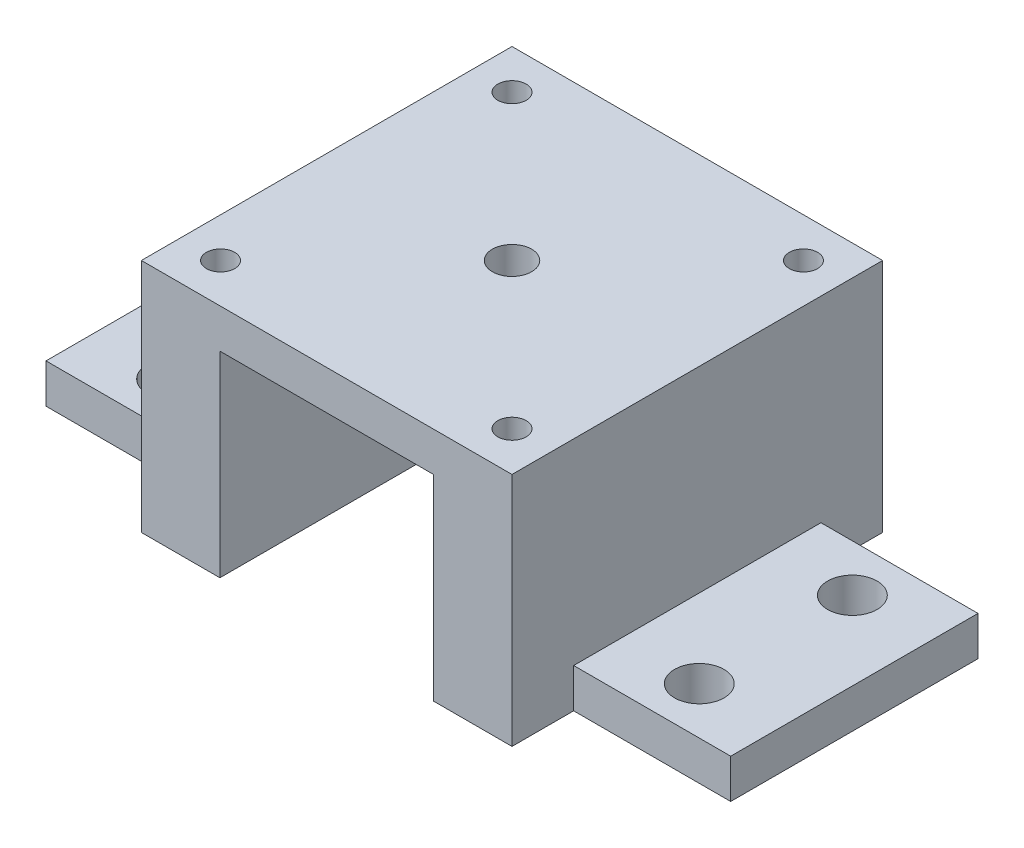
ISO-10303-21;
HEADER;
FILE_DESCRIPTION(('STEP AP214'),'2;1');
FILE_NAME('part.step','',(''),(''),'','','');
FILE_SCHEMA(('AUTOMOTIVE_DESIGN { 1 0 10303 214 1 1 1 1 }'));
ENDSEC;
DATA;
#1=APPLICATION_CONTEXT('core data for automotive mechanical design processes');
#2=APPLICATION_PROTOCOL_DEFINITION('international standard','automotive_design',2000,#1);
#3=PRODUCT_CONTEXT('',#1,'mechanical');
#4=PRODUCT('Part','Part','',(#3));
#5=PRODUCT_RELATED_PRODUCT_CATEGORY('part','',(#4));
#6=PRODUCT_DEFINITION_FORMATION('','',#4);
#7=PRODUCT_DEFINITION_CONTEXT('part definition',#1,'design');
#8=PRODUCT_DEFINITION('design','',#6,#7);
#9=PRODUCT_DEFINITION_SHAPE('','',#8);
#10=(LENGTH_UNIT() NAMED_UNIT(*) SI_UNIT(.MILLI.,.METRE.));
#11=(NAMED_UNIT(*) PLANE_ANGLE_UNIT() SI_UNIT($,.RADIAN.));
#12=(NAMED_UNIT(*) SI_UNIT($,.STERADIAN.) SOLID_ANGLE_UNIT());
#13=UNCERTAINTY_MEASURE_WITH_UNIT(LENGTH_MEASURE(1.E-05),#10,'distance_accuracy_value','');
#14=(GEOMETRIC_REPRESENTATION_CONTEXT(3) GLOBAL_UNCERTAINTY_ASSIGNED_CONTEXT((#13)) GLOBAL_UNIT_ASSIGNED_CONTEXT((#10,
#11,#12)) REPRESENTATION_CONTEXT('',''));
#15=CARTESIAN_POINT('',(0.,0.,0.));
#16=DIRECTION('',(0.,0.,1.));
#17=DIRECTION('',(1.,0.,0.));
#18=AXIS2_PLACEMENT_3D('',#15,#16,#17);
#19=CARTESIAN_POINT('',(-59.944,38.1,-25.0118450704225));
#20=DIRECTION('',(1.,0.,0.));
#21=DIRECTION('',(0.,0.,-1.));
#22=AXIS2_PLACEMENT_3D('',#19,#20,#21);
#23=PLANE('',#22);
#24=DIRECTION('',(0.,-1.,0.));
#25=VECTOR('',#24,1.);
#26=CARTESIAN_POINT('',(-59.944,0.,-15.0398451924225));
#27=LINE('',#26,#25);
#28=CARTESIAN_POINT('',(-59.944,6.35,-15.0398451924225));
#29=VERTEX_POINT('',#28);
#30=CARTESIAN_POINT('',(-59.944,0.,-15.0398451924225));
#31=VERTEX_POINT('',#30);
#32=EDGE_CURVE('E61',#29,#31,#27,.T.);
#33=ORIENTED_EDGE('',*,*,#32,.F.);
#34=DIRECTION('',(0.,0.,-1.));
#35=VECTOR('',#34,1.);
#36=CARTESIAN_POINT('',(-59.944,6.35,-15.0398451924225));
#37=LINE('',#36,#35);
#38=CARTESIAN_POINT('',(-59.944,6.35,24.9601548075775));
#39=VERTEX_POINT('',#38);
#40=EDGE_CURVE('E181',#39,#29,#37,.T.);
#41=ORIENTED_EDGE('',*,*,#40,.F.);
#42=DIRECTION('',(0.,1.,0.));
#43=VECTOR('',#42,1.);
#44=CARTESIAN_POINT('',(-59.944,0.,24.9601548075775));
#45=LINE('',#44,#43);
#46=CARTESIAN_POINT('',(-59.944,0.,24.9601548075775));
#47=VERTEX_POINT('',#46);
#48=EDGE_CURVE('E67',#47,#39,#45,.T.);
#49=ORIENTED_EDGE('',*,*,#48,.F.);
#50=DIRECTION('',(0.,0.,1.));
#51=VECTOR('',#50,1.);
#52=CARTESIAN_POINT('',(-59.944,0.,-25.0118450704225));
#53=LINE('',#52,#51);
#54=CARTESIAN_POINT('',(-59.944,0.,34.9321549295775));
#55=VERTEX_POINT('',#54);
#56=EDGE_CURVE('E263',#47,#55,#53,.T.);
#57=ORIENTED_EDGE('',*,*,#56,.T.);
#58=DIRECTION('',(0.,-1.,0.));
#59=VECTOR('',#58,1.);
#60=CARTESIAN_POINT('',(-59.944,38.1,34.9321549295775));
#61=LINE('',#60,#59);
#62=CARTESIAN_POINT('',(-59.944,38.1,34.9321549295775));
#63=VERTEX_POINT('',#62);
#64=EDGE_CURVE('E11',#63,#55,#61,.T.);
#65=ORIENTED_EDGE('',*,*,#64,.F.);
#66=DIRECTION('',(0.,0.,1.));
#67=VECTOR('',#66,1.);
#68=CARTESIAN_POINT('',(-59.944,38.1,-25.0118450704225));
#69=LINE('',#68,#67);
#70=CARTESIAN_POINT('',(-59.944,38.1,-25.0118450704225));
#71=VERTEX_POINT('',#70);
#72=EDGE_CURVE('E273',#71,#63,#69,.T.);
#73=ORIENTED_EDGE('',*,*,#72,.F.);
#74=DIRECTION('',(0.,-1.,0.));
#75=VECTOR('',#74,1.);
#76=CARTESIAN_POINT('',(-59.944,38.1,-25.0118450704225));
#77=LINE('',#76,#75);
#78=CARTESIAN_POINT('',(-59.944,0.,-25.0118450704225));
#79=VERTEX_POINT('',#78);
#80=EDGE_CURVE('E289',#71,#79,#77,.T.);
#81=ORIENTED_EDGE('',*,*,#80,.T.);
#82=EDGE_CURVE('E290',#79,#31,#53,.T.);
#83=ORIENTED_EDGE('',*,*,#82,.T.);
#84=EDGE_LOOP('',(#33,#41,#49,#57,#65,#73,#81,#83));
#85=FACE_BOUND('',#84,.T.);
#86=ADVANCED_FACE('F45',(#85),#23,.F.);
#87=CARTESIAN_POINT('',(0.,0.,0.));
#88=DIRECTION('',(0.,1.,0.));
#89=DIRECTION('',(0.,0.,1.));
#90=AXIS2_PLACEMENT_3D('',#87,#88,#89);
#91=PLANE('',#90);
#92=CARTESIAN_POINT('',(-72.644,0.,17.3401548075775));
#93=DIRECTION('',(0.,1.,0.));
#94=DIRECTION('',(0.,0.,1.));
#95=AXIS2_PLACEMENT_3D('',#92,#93,#94);
#96=CIRCLE('',#95,4.00000000000001);
#97=CARTESIAN_POINT('',(-72.644,0.,21.3401548075775));
#98=VERTEX_POINT('',#97);
#99=EDGE_CURVE('E410',#98,#98,#96,.T.);
#100=ORIENTED_EDGE('',*,*,#99,.T.);
#101=EDGE_LOOP('',(#100));
#102=FACE_BOUND('',#101,.T.);
#103=CARTESIAN_POINT('',(-72.644,0.,-7.41984519242252));
#104=DIRECTION('',(0.,1.,0.));
#105=DIRECTION('',(0.,0.,1.));
#106=AXIS2_PLACEMENT_3D('',#103,#104,#105);
#107=CIRCLE('',#106,4.00000000000001);
#108=CARTESIAN_POINT('',(-72.644,0.,-3.41984519242251));
#109=VERTEX_POINT('',#108);
#110=EDGE_CURVE('E419',#109,#109,#107,.T.);
#111=ORIENTED_EDGE('',*,*,#110,.T.);
#112=EDGE_LOOP('',(#111));
#113=FACE_BOUND('',#112,.T.);
#114=DIRECTION('',(1.,0.,0.));
#115=VECTOR('',#114,1.);
#116=CARTESIAN_POINT('',(-59.944,0.,-25.0118450704225));
#117=LINE('',#116,#115);
#118=CARTESIAN_POINT('',(-47.244,0.,-25.0118450704225));
#119=VERTEX_POINT('',#118);
#120=EDGE_CURVE('E278',#79,#119,#117,.T.);
#121=ORIENTED_EDGE('',*,*,#120,.T.);
#122=DIRECTION('',(0.,0.,1.));
#123=VECTOR('',#122,1.);
#124=CARTESIAN_POINT('',(-47.244,0.,-25.0118450704225));
#125=LINE('',#124,#123);
#126=CARTESIAN_POINT('',(-47.244,0.,34.9321549295775));
#127=VERTEX_POINT('',#126);
#128=EDGE_CURVE('E249',#119,#127,#125,.T.);
#129=ORIENTED_EDGE('',*,*,#128,.T.);
#130=DIRECTION('',(1.,0.,0.));
#131=VECTOR('',#130,1.);
#132=CARTESIAN_POINT('',(-59.944,0.,34.9321549295775));
#133=LINE('',#132,#131);
#134=EDGE_CURVE('E294',#55,#127,#133,.T.);
#135=ORIENTED_EDGE('',*,*,#134,.F.);
#136=ORIENTED_EDGE('',*,*,#56,.F.);
#137=DIRECTION('',(1.,0.,0.));
#138=VECTOR('',#137,1.);
#139=CARTESIAN_POINT('',(-85.344,0.,24.9601548075775));
#140=LINE('',#139,#138);
#141=CARTESIAN_POINT('',(-85.344,0.,24.9601548075775));
#142=VERTEX_POINT('',#141);
#143=EDGE_CURVE('E166',#142,#47,#140,.T.);
#144=ORIENTED_EDGE('',*,*,#143,.F.);
#145=DIRECTION('',(0.,0.,1.));
#146=VECTOR('',#145,1.);
#147=CARTESIAN_POINT('',(-85.344,0.,-15.0398451924225));
#148=LINE('',#147,#146);
#149=CARTESIAN_POINT('',(-85.344,0.,-15.0398451924225));
#150=VERTEX_POINT('',#149);
#151=EDGE_CURVE('E158',#150,#142,#148,.T.);
#152=ORIENTED_EDGE('',*,*,#151,.F.);
#153=DIRECTION('',(1.,0.,0.));
#154=VECTOR('',#153,1.);
#155=CARTESIAN_POINT('',(-85.344,0.,-15.0398451924225));
#156=LINE('',#155,#154);
#157=EDGE_CURVE('E164',#150,#31,#156,.T.);
#158=ORIENTED_EDGE('',*,*,#157,.T.);
#159=ORIENTED_EDGE('',*,*,#82,.F.);
#160=EDGE_LOOP('',(#121,#129,#135,#136,#144,#152,#158,#159));
#161=FACE_BOUND('',#160,.T.);
#162=ADVANCED_FACE('F161',(#102,#113,#161),#91,.F.);
#163=CARTESIAN_POINT('',(-59.944,38.1,34.9321549295775));
#164=DIRECTION('',(0.,0.,-1.));
#165=DIRECTION('',(-1.,0.,0.));
#166=AXIS2_PLACEMENT_3D('',#163,#164,#165);
#167=PLANE('',#166);
#168=ORIENTED_EDGE('',*,*,#134,.T.);
#169=DIRECTION('',(0.,-1.,0.));
#170=VECTOR('',#169,1.);
#171=CARTESIAN_POINT('',(-47.244,0.,34.9321549295775));
#172=LINE('',#171,#170);
#173=CARTESIAN_POINT('',(-47.244,31.75,34.9321549295775));
#174=VERTEX_POINT('',#173);
#175=EDGE_CURVE('E250',#174,#127,#172,.T.);
#176=ORIENTED_EDGE('',*,*,#175,.F.);
#177=DIRECTION('',(-1.,0.,0.));
#178=VECTOR('',#177,1.);
#179=CARTESIAN_POINT('',(-47.244,31.75,34.9321549295775));
#180=LINE('',#179,#178);
#181=CARTESIAN_POINT('',(-12.7,31.75,34.9321549295775));
#182=VERTEX_POINT('',#181);
#183=EDGE_CURVE('E241',#182,#174,#180,.T.);
#184=ORIENTED_EDGE('',*,*,#183,.F.);
#185=DIRECTION('',(0.,1.,0.));
#186=VECTOR('',#185,1.);
#187=CARTESIAN_POINT('',(-12.7,0.,34.9321549295775));
#188=LINE('',#187,#186);
#189=CARTESIAN_POINT('',(-12.7,0.,34.9321549295775));
#190=VERTEX_POINT('',#189);
#191=EDGE_CURVE('E253',#190,#182,#188,.T.);
#192=ORIENTED_EDGE('',*,*,#191,.F.);
#193=CARTESIAN_POINT('',(0.,0.,34.9321549295775));
#194=VERTEX_POINT('',#193);
#195=EDGE_CURVE('E293',#190,#194,#133,.T.);
#196=ORIENTED_EDGE('',*,*,#195,.T.);
#197=DIRECTION('',(0.,-1.,0.));
#198=VECTOR('',#197,1.);
#199=CARTESIAN_POINT('',(0.,38.1,34.9321549295775));
#200=LINE('',#199,#198);
#201=CARTESIAN_POINT('',(0.,38.1,34.9321549295775));
#202=VERTEX_POINT('',#201);
#203=EDGE_CURVE('E54',#202,#194,#200,.T.);
#204=ORIENTED_EDGE('',*,*,#203,.F.);
#205=DIRECTION('',(1.,0.,0.));
#206=VECTOR('',#205,1.);
#207=CARTESIAN_POINT('',(-59.944,38.1,34.9321549295775));
#208=LINE('',#207,#206);
#209=EDGE_CURVE('E277',#63,#202,#208,.T.);
#210=ORIENTED_EDGE('',*,*,#209,.F.);
#211=ORIENTED_EDGE('',*,*,#64,.T.);
#212=EDGE_LOOP('',(#168,#176,#184,#192,#196,#204,#210,#211));
#213=FACE_BOUND('',#212,.T.);
#214=ADVANCED_FACE('F320',(#213),#167,.F.);
#215=CARTESIAN_POINT('',(0.,38.1,-25.0118450704225));
#216=DIRECTION('',(1.,0.,0.));
#217=DIRECTION('',(0.,0.,-1.));
#218=AXIS2_PLACEMENT_3D('',#215,#216,#217);
#219=PLANE('',#218);
#220=DIRECTION('',(0.,-1.,0.));
#221=VECTOR('',#220,1.);
#222=CARTESIAN_POINT('',(0.,0.,24.9601548075775));
#223=LINE('',#222,#221);
#224=CARTESIAN_POINT('',(0.,6.35,24.9601548075775));
#225=VERTEX_POINT('',#224);
#226=CARTESIAN_POINT('',(0.,0.,24.9601548075775));
#227=VERTEX_POINT('',#226);
#228=EDGE_CURVE('E185',#225,#227,#223,.T.);
#229=ORIENTED_EDGE('',*,*,#228,.F.);
#230=DIRECTION('',(0.,0.,1.));
#231=VECTOR('',#230,1.);
#232=CARTESIAN_POINT('',(0.,6.35,24.9601548075775));
#233=LINE('',#232,#231);
#234=CARTESIAN_POINT('',(0.,6.35,-15.0398451924225));
#235=VERTEX_POINT('',#234);
#236=EDGE_CURVE('E201',#235,#225,#233,.T.);
#237=ORIENTED_EDGE('',*,*,#236,.F.);
#238=DIRECTION('',(0.,1.,0.));
#239=VECTOR('',#238,1.);
#240=CARTESIAN_POINT('',(0.,0.,-15.0398451924225));
#241=LINE('',#240,#239);
#242=CARTESIAN_POINT('',(0.,0.,-15.0398451924225));
#243=VERTEX_POINT('',#242);
#244=EDGE_CURVE('E190',#243,#235,#241,.T.);
#245=ORIENTED_EDGE('',*,*,#244,.F.);
#246=DIRECTION('',(0.,0.,1.));
#247=VECTOR('',#246,1.);
#248=CARTESIAN_POINT('',(0.,0.,-25.0118450704225));
#249=LINE('',#248,#247);
#250=CARTESIAN_POINT('',(0.,0.,-25.0118450704225));
#251=VERTEX_POINT('',#250);
#252=EDGE_CURVE('E299',#251,#243,#249,.T.);
#253=ORIENTED_EDGE('',*,*,#252,.F.);
#254=DIRECTION('',(0.,-1.,0.));
#255=VECTOR('',#254,1.);
#256=CARTESIAN_POINT('',(0.,38.1,-25.0118450704225));
#257=LINE('',#256,#255);
#258=CARTESIAN_POINT('',(0.,38.1,-25.0118450704225));
#259=VERTEX_POINT('',#258);
#260=EDGE_CURVE('E308',#259,#251,#257,.T.);
#261=ORIENTED_EDGE('',*,*,#260,.F.);
#262=DIRECTION('',(0.,0.,1.));
#263=VECTOR('',#262,1.);
#264=CARTESIAN_POINT('',(0.,38.1,-25.0118450704225));
#265=LINE('',#264,#263);
#266=EDGE_CURVE('E281',#259,#202,#265,.T.);
#267=ORIENTED_EDGE('',*,*,#266,.T.);
#268=ORIENTED_EDGE('',*,*,#203,.T.);
#269=EDGE_CURVE('E298',#227,#194,#249,.T.);
#270=ORIENTED_EDGE('',*,*,#269,.F.);
#271=EDGE_LOOP('',(#229,#237,#245,#253,#261,#267,#268,#270));
#272=FACE_BOUND('',#271,.T.);
#273=ADVANCED_FACE('F316',(#272),#219,.T.);
#274=CARTESIAN_POINT('',(-59.944,38.1,-25.0118450704225));
#275=DIRECTION('',(0.,0.,-1.));
#276=DIRECTION('',(-1.,0.,0.));
#277=AXIS2_PLACEMENT_3D('',#274,#275,#276);
#278=PLANE('',#277);
#279=DIRECTION('',(0.,-1.,0.));
#280=VECTOR('',#279,1.);
#281=CARTESIAN_POINT('',(-47.244,0.,-25.0118450704225));
#282=LINE('',#281,#280);
#283=CARTESIAN_POINT('',(-47.244,31.75,-25.0118450704225));
#284=VERTEX_POINT('',#283);
#285=EDGE_CURVE('E236',#284,#119,#282,.T.);
#286=ORIENTED_EDGE('',*,*,#285,.T.);
#287=ORIENTED_EDGE('',*,*,#120,.F.);
#288=ORIENTED_EDGE('',*,*,#80,.F.);
#289=DIRECTION('',(1.,0.,0.));
#290=VECTOR('',#289,1.);
#291=CARTESIAN_POINT('',(-59.944,38.1,-25.0118450704225));
#292=LINE('',#291,#290);
#293=EDGE_CURVE('E285',#71,#259,#292,.T.);
#294=ORIENTED_EDGE('',*,*,#293,.T.);
#295=ORIENTED_EDGE('',*,*,#260,.T.);
#296=CARTESIAN_POINT('',(-12.7,0.,-25.0118450704225));
#297=VERTEX_POINT('',#296);
#298=EDGE_CURVE('E303',#297,#251,#117,.T.);
#299=ORIENTED_EDGE('',*,*,#298,.F.);
#300=DIRECTION('',(0.,1.,0.));
#301=VECTOR('',#300,1.);
#302=CARTESIAN_POINT('',(-12.7,0.,-25.0118450704225));
#303=LINE('',#302,#301);
#304=CARTESIAN_POINT('',(-12.7,31.75,-25.0118450704225));
#305=VERTEX_POINT('',#304);
#306=EDGE_CURVE('E240',#297,#305,#303,.T.);
#307=ORIENTED_EDGE('',*,*,#306,.T.);
#308=DIRECTION('',(-1.,0.,0.));
#309=VECTOR('',#308,1.);
#310=CARTESIAN_POINT('',(-47.244,31.75,-25.0118450704225));
#311=LINE('',#310,#309);
#312=EDGE_CURVE('E245',#305,#284,#311,.T.);
#313=ORIENTED_EDGE('',*,*,#312,.T.);
#314=EDGE_LOOP('',(#286,#287,#288,#294,#295,#299,#307,#313));
#315=FACE_BOUND('',#314,.T.);
#316=ADVANCED_FACE('F382',(#315),#278,.T.);
#317=CARTESIAN_POINT('',(0.,38.1,0.));
#318=DIRECTION('',(0.,1.,0.));
#319=DIRECTION('',(0.,0.,1.));
#320=AXIS2_PLACEMENT_3D('',#317,#318,#319);
#321=PLANE('',#320);
#322=CARTESIAN_POINT('',(-6.4008,38.1,-18.6110450704225));
#323=DIRECTION('',(0.,1.,0.));
#324=DIRECTION('',(0.,0.,1.));
#325=AXIS2_PLACEMENT_3D('',#322,#323,#324);
#326=CIRCLE('',#325,2.286);
#327=CARTESIAN_POINT('',(-6.4008,38.1,-16.3250450704225));
#328=VERTEX_POINT('',#327);
#329=EDGE_CURVE('E702',#328,#328,#326,.T.);
#330=ORIENTED_EDGE('',*,*,#329,.F.);
#331=EDGE_LOOP('',(#330));
#332=FACE_BOUND('',#331,.T.);
#333=CARTESIAN_POINT('',(-53.5432,38.1,28.5313549295775));
#334=DIRECTION('',(0.,1.,0.));
#335=DIRECTION('',(0.,0.,1.));
#336=AXIS2_PLACEMENT_3D('',#333,#334,#335);
#337=CIRCLE('',#336,2.28599999999999);
#338=CARTESIAN_POINT('',(-53.5432,38.1,30.8173549295775));
#339=VERTEX_POINT('',#338);
#340=EDGE_CURVE('E722',#339,#339,#337,.T.);
#341=ORIENTED_EDGE('',*,*,#340,.F.);
#342=EDGE_LOOP('',(#341));
#343=FACE_BOUND('',#342,.T.);
#344=CARTESIAN_POINT('',(-6.4008,38.1,28.5313549295775));
#345=DIRECTION('',(0.,1.,0.));
#346=DIRECTION('',(0.,0.,1.));
#347=AXIS2_PLACEMENT_3D('',#344,#345,#346);
#348=CIRCLE('',#347,2.286);
#349=CARTESIAN_POINT('',(-6.4008,38.1,30.8173549295775));
#350=VERTEX_POINT('',#349);
#351=EDGE_CURVE('E711',#350,#350,#348,.T.);
#352=ORIENTED_EDGE('',*,*,#351,.F.);
#353=EDGE_LOOP('',(#352));
#354=FACE_BOUND('',#353,.T.);
#355=CARTESIAN_POINT('',(-53.5432,38.1,-18.6110450704225));
#356=DIRECTION('',(0.,1.,0.));
#357=DIRECTION('',(0.,0.,1.));
#358=AXIS2_PLACEMENT_3D('',#355,#356,#357);
#359=CIRCLE('',#358,2.28599999999999);
#360=CARTESIAN_POINT('',(-53.5432,38.1,-16.3250450704225));
#361=VERTEX_POINT('',#360);
#362=EDGE_CURVE('E401',#361,#361,#359,.T.);
#363=ORIENTED_EDGE('',*,*,#362,.F.);
#364=EDGE_LOOP('',(#363));
#365=FACE_BOUND('',#364,.T.);
#366=CARTESIAN_POINT('',(-29.972,38.1,4.96015492957747));
#367=DIRECTION('',(0.,1.,0.));
#368=DIRECTION('',(0.,0.,1.));
#369=AXIS2_PLACEMENT_3D('',#366,#367,#368);
#370=CIRCLE('',#369,3.175);
#371=CARTESIAN_POINT('',(-29.972,38.1,8.13515492957747));
#372=VERTEX_POINT('',#371);
#373=EDGE_CURVE('E232',#372,#372,#370,.T.);
#374=ORIENTED_EDGE('',*,*,#373,.F.);
#375=EDGE_LOOP('',(#374));
#376=FACE_BOUND('',#375,.T.);
#377=ORIENTED_EDGE('',*,*,#72,.T.);
#378=ORIENTED_EDGE('',*,*,#209,.T.);
#379=ORIENTED_EDGE('',*,*,#266,.F.);
#380=ORIENTED_EDGE('',*,*,#293,.F.);
#381=EDGE_LOOP('',(#377,#378,#379,#380));
#382=FACE_BOUND('',#381,.T.);
#383=ADVANCED_FACE('F373',(#332,#343,#354,#365,#376,#382),#321,.T.);
#384=CARTESIAN_POINT('',(12.7,0.,-7.41984519242253));
#385=DIRECTION('',(0.,1.,0.));
#386=DIRECTION('',(0.,0.,1.));
#387=AXIS2_PLACEMENT_3D('',#384,#385,#386);
#388=CIRCLE('',#387,4.);
#389=CARTESIAN_POINT('',(12.7,0.,-3.41984519242253));
#390=VERTEX_POINT('',#389);
#391=EDGE_CURVE('E387',#390,#390,#388,.T.);
#392=ORIENTED_EDGE('',*,*,#391,.T.);
#393=EDGE_LOOP('',(#392));
#394=FACE_BOUND('',#393,.T.);
#395=CARTESIAN_POINT('',(12.7,0.,17.3401548075775));
#396=DIRECTION('',(0.,1.,0.));
#397=DIRECTION('',(0.,0.,1.));
#398=AXIS2_PLACEMENT_3D('',#395,#396,#397);
#399=CIRCLE('',#398,4.);
#400=CARTESIAN_POINT('',(12.7,0.,21.3401548075775));
#401=VERTEX_POINT('',#400);
#402=EDGE_CURVE('E390',#401,#401,#399,.T.);
#403=ORIENTED_EDGE('',*,*,#402,.T.);
#404=EDGE_LOOP('',(#403));
#405=FACE_BOUND('',#404,.T.);
#406=ORIENTED_EDGE('',*,*,#195,.F.);
#407=DIRECTION('',(0.,0.,1.));
#408=VECTOR('',#407,1.);
#409=CARTESIAN_POINT('',(-12.7,0.,-25.0118450704225));
#410=LINE('',#409,#408);
#411=EDGE_CURVE('E267',#297,#190,#410,.T.);
#412=ORIENTED_EDGE('',*,*,#411,.F.);
#413=ORIENTED_EDGE('',*,*,#298,.T.);
#414=ORIENTED_EDGE('',*,*,#252,.T.);
#415=DIRECTION('',(-1.,0.,0.));
#416=VECTOR('',#415,1.);
#417=CARTESIAN_POINT('',(25.4,0.,-15.0398451924225));
#418=LINE('',#417,#416);
#419=CARTESIAN_POINT('',(25.4,0.,-15.0398451924225));
#420=VERTEX_POINT('',#419);
#421=EDGE_CURVE('E224',#420,#243,#418,.T.);
#422=ORIENTED_EDGE('',*,*,#421,.F.);
#423=DIRECTION('',(0.,0.,-1.));
#424=VECTOR('',#423,1.);
#425=CARTESIAN_POINT('',(25.4,0.,24.9601548075775));
#426=LINE('',#425,#424);
#427=CARTESIAN_POINT('',(25.4,0.,24.9601548075775));
#428=VERTEX_POINT('',#427);
#429=EDGE_CURVE('E200',#428,#420,#426,.T.);
#430=ORIENTED_EDGE('',*,*,#429,.F.);
#431=DIRECTION('',(-1.,0.,0.));
#432=VECTOR('',#431,1.);
#433=CARTESIAN_POINT('',(25.4,0.,24.9601548075775));
#434=LINE('',#433,#432);
#435=EDGE_CURVE('E228',#428,#227,#434,.T.);
#436=ORIENTED_EDGE('',*,*,#435,.T.);
#437=ORIENTED_EDGE('',*,*,#269,.T.);
#438=EDGE_LOOP('',(#406,#412,#413,#414,#422,#430,#436,#437));
#439=FACE_BOUND('',#438,.T.);
#440=ADVANCED_FACE('F362',(#394,#405,#439),#91,.F.);
#441=CARTESIAN_POINT('',(-47.244,0.,-25.0118450704225));
#442=DIRECTION('',(-1.,0.,0.));
#443=DIRECTION('',(0.,0.,1.));
#444=AXIS2_PLACEMENT_3D('',#441,#442,#443);
#445=PLANE('',#444);
#446=ORIENTED_EDGE('',*,*,#175,.T.);
#447=ORIENTED_EDGE('',*,*,#128,.F.);
#448=ORIENTED_EDGE('',*,*,#285,.F.);
#449=DIRECTION('',(0.,0.,1.));
#450=VECTOR('',#449,1.);
#451=CARTESIAN_POINT('',(-47.244,31.75,-25.0118450704225));
#452=LINE('',#451,#450);
#453=EDGE_CURVE('E260',#284,#174,#452,.T.);
#454=ORIENTED_EDGE('',*,*,#453,.T.);
#455=EDGE_LOOP('',(#446,#447,#448,#454));
#456=FACE_BOUND('',#455,.T.);
#457=ADVANCED_FACE('F372',(#456),#445,.F.);
#458=CARTESIAN_POINT('',(-47.244,31.75,-25.0118450704225));
#459=DIRECTION('',(0.,1.,0.));
#460=DIRECTION('',(0.,0.,1.));
#461=AXIS2_PLACEMENT_3D('',#458,#459,#460);
#462=PLANE('',#461);
#463=CARTESIAN_POINT('',(-29.972,31.75,4.96015492957747));
#464=DIRECTION('',(0.,1.,0.));
#465=DIRECTION('',(0.,0.,1.));
#466=AXIS2_PLACEMENT_3D('',#463,#464,#465);
#467=CIRCLE('',#466,3.175);
#468=CARTESIAN_POINT('',(-29.972,31.75,8.13515492957747));
#469=VERTEX_POINT('',#468);
#470=EDGE_CURVE('E48',#469,#469,#467,.T.);
#471=ORIENTED_EDGE('',*,*,#470,.T.);
#472=EDGE_LOOP('',(#471));
#473=FACE_BOUND('',#472,.T.);
#474=ORIENTED_EDGE('',*,*,#183,.T.);
#475=ORIENTED_EDGE('',*,*,#453,.F.);
#476=ORIENTED_EDGE('',*,*,#312,.F.);
#477=DIRECTION('',(0.,0.,1.));
#478=VECTOR('',#477,1.);
#479=CARTESIAN_POINT('',(-12.7,31.75,-25.0118450704225));
#480=LINE('',#479,#478);
#481=EDGE_CURVE('E264',#305,#182,#480,.T.);
#482=ORIENTED_EDGE('',*,*,#481,.T.);
#483=EDGE_LOOP('',(#474,#475,#476,#482));
#484=FACE_BOUND('',#483,.T.);
#485=ADVANCED_FACE('F333',(#473,#484),#462,.F.);
#486=CARTESIAN_POINT('',(-12.7,0.,-25.0118450704225));
#487=DIRECTION('',(1.,0.,0.));
#488=DIRECTION('',(0.,0.,-1.));
#489=AXIS2_PLACEMENT_3D('',#486,#487,#488);
#490=PLANE('',#489);
#491=ORIENTED_EDGE('',*,*,#191,.T.);
#492=ORIENTED_EDGE('',*,*,#481,.F.);
#493=ORIENTED_EDGE('',*,*,#306,.F.);
#494=ORIENTED_EDGE('',*,*,#411,.T.);
#495=EDGE_LOOP('',(#491,#492,#493,#494));
#496=FACE_BOUND('',#495,.T.);
#497=ADVANCED_FACE('F339',(#496),#490,.F.);
#498=CARTESIAN_POINT('',(-29.972,0.,4.96015492957747));
#499=DIRECTION('',(0.,1.,0.));
#500=DIRECTION('',(0.,0.,1.));
#501=AXIS2_PLACEMENT_3D('',#498,#499,#500);
#502=CYLINDRICAL_SURFACE('',#501,3.175);
#503=CARTESIAN_POINT('',(-29.972,38.1,8.13515492957747));
#504=CARTESIAN_POINT('',(-29.972,38.0338541666667,8.13515492957747));
#505=CARTESIAN_POINT('',(-29.972,37.9677083333333,8.13515492957747));
#506=CARTESIAN_POINT('',(-29.972,37.8354166666667,8.13515492957747));
#507=CARTESIAN_POINT('',(-29.972,37.7692708333333,8.13515492957747));
#508=CARTESIAN_POINT('',(-29.972,37.6369791666667,8.13515492957747));
#509=CARTESIAN_POINT('',(-29.972,37.5708333333333,8.13515492957747));
#510=CARTESIAN_POINT('',(-29.972,37.4385416666667,8.13515492957747));
#511=CARTESIAN_POINT('',(-29.972,37.3723958333333,8.13515492957747));
#512=CARTESIAN_POINT('',(-29.972,37.2401041666667,8.13515492957747));
#513=CARTESIAN_POINT('',(-29.972,37.1739583333333,8.13515492957747));
#514=CARTESIAN_POINT('',(-29.972,37.0416666666667,8.13515492957747));
#515=CARTESIAN_POINT('',(-29.972,36.9755208333333,8.13515492957747));
#516=CARTESIAN_POINT('',(-29.972,36.8432291666667,8.13515492957747));
#517=CARTESIAN_POINT('',(-29.972,36.7770833333333,8.13515492957747));
#518=CARTESIAN_POINT('',(-29.972,36.6447916666667,8.13515492957747));
#519=CARTESIAN_POINT('',(-29.972,36.5786458333333,8.13515492957747));
#520=CARTESIAN_POINT('',(-29.972,36.4463541666667,8.13515492957747));
#521=CARTESIAN_POINT('',(-29.972,36.3802083333333,8.13515492957747));
#522=CARTESIAN_POINT('',(-29.972,36.2479166666667,8.13515492957747));
#523=CARTESIAN_POINT('',(-29.972,36.1817708333333,8.13515492957747));
#524=CARTESIAN_POINT('',(-29.972,36.0494791666667,8.13515492957747));
#525=CARTESIAN_POINT('',(-29.972,35.9833333333333,8.13515492957747));
#526=CARTESIAN_POINT('',(-29.972,35.8510416666667,8.13515492957747));
#527=CARTESIAN_POINT('',(-29.972,35.7848958333333,8.13515492957747));
#528=CARTESIAN_POINT('',(-29.972,35.6526041666667,8.13515492957747));
#529=CARTESIAN_POINT('',(-29.972,35.5864583333333,8.13515492957747));
#530=CARTESIAN_POINT('',(-29.972,35.4541666666667,8.13515492957747));
#531=CARTESIAN_POINT('',(-29.972,35.3880208333333,8.13515492957747));
#532=CARTESIAN_POINT('',(-29.972,35.2557291666667,8.13515492957747));
#533=CARTESIAN_POINT('',(-29.972,35.1895833333333,8.13515492957747));
#534=CARTESIAN_POINT('',(-29.972,35.0572916666667,8.13515492957747));
#535=CARTESIAN_POINT('',(-29.972,34.9911458333333,8.13515492957747));
#536=CARTESIAN_POINT('',(-29.972,34.8588541666667,8.13515492957747));
#537=CARTESIAN_POINT('',(-29.972,34.7927083333333,8.13515492957747));
#538=CARTESIAN_POINT('',(-29.972,34.6604166666667,8.13515492957747));
#539=CARTESIAN_POINT('',(-29.972,34.5942708333333,8.13515492957747));
#540=CARTESIAN_POINT('',(-29.972,34.4619791666667,8.13515492957747));
#541=CARTESIAN_POINT('',(-29.972,34.3958333333333,8.13515492957747));
#542=CARTESIAN_POINT('',(-29.972,34.2635416666667,8.13515492957747));
#543=CARTESIAN_POINT('',(-29.972,34.1973958333333,8.13515492957747));
#544=CARTESIAN_POINT('',(-29.972,34.0651041666667,8.13515492957747));
#545=CARTESIAN_POINT('',(-29.972,33.9989583333333,8.13515492957747));
#546=CARTESIAN_POINT('',(-29.972,33.8666666666667,8.13515492957747));
#547=CARTESIAN_POINT('',(-29.972,33.8005208333333,8.13515492957747));
#548=CARTESIAN_POINT('',(-29.972,33.6682291666667,8.13515492957747));
#549=CARTESIAN_POINT('',(-29.972,33.6020833333333,8.13515492957747));
#550=CARTESIAN_POINT('',(-29.972,33.4697916666667,8.13515492957747));
#551=CARTESIAN_POINT('',(-29.972,33.4036458333333,8.13515492957747));
#552=CARTESIAN_POINT('',(-29.972,33.2713541666667,8.13515492957747));
#553=CARTESIAN_POINT('',(-29.972,33.2052083333333,8.13515492957747));
#554=CARTESIAN_POINT('',(-29.972,33.0729166666667,8.13515492957747));
#555=CARTESIAN_POINT('',(-29.972,33.0067708333333,8.13515492957747));
#556=CARTESIAN_POINT('',(-29.972,32.8744791666667,8.13515492957747));
#557=CARTESIAN_POINT('',(-29.972,32.8083333333333,8.13515492957747));
#558=CARTESIAN_POINT('',(-29.972,32.6760416666667,8.13515492957747));
#559=CARTESIAN_POINT('',(-29.972,32.6098958333333,8.13515492957747));
#560=CARTESIAN_POINT('',(-29.972,32.4776041666667,8.13515492957747));
#561=CARTESIAN_POINT('',(-29.972,32.4114583333333,8.13515492957747));
#562=CARTESIAN_POINT('',(-29.972,32.2791666666667,8.13515492957747));
#563=CARTESIAN_POINT('',(-29.972,32.2130208333333,8.13515492957747));
#564=CARTESIAN_POINT('',(-29.972,32.0807291666667,8.13515492957747));
#565=CARTESIAN_POINT('',(-29.972,32.0145833333333,8.13515492957747));
#566=CARTESIAN_POINT('',(-29.972,31.8822916666667,8.13515492957747));
#567=CARTESIAN_POINT('',(-29.972,31.8161458333333,8.13515492957747));
#568=CARTESIAN_POINT('',(-29.972,31.75,8.13515492957747));
#569=B_SPLINE_CURVE_WITH_KNOTS('',3,(#503,#504,#505,#506,#507,#508,#509,#510,#511,#512,#513,
#514,#515,#516,#517,#518,#519,#520,#521,#522,#523,#524,#525,#526,#527,#528,#529,#530,#531,#532,
#533,#534,#535,#536,#537,#538,#539,#540,#541,#542,#543,#544,#545,#546,#547,#548,#549,#550,#551,
#552,#553,#554,#555,#556,#557,#558,#559,#560,#561,#562,#563,#564,#565,#566,#567,#568),
.UNSPECIFIED.,.F.,.F.,(4,2,2,2,2,2,2,2,2,2,2,2,2,2,2,2,2,2,2,2,2,2,2,2,2,2,2,2,2,2,2,2,4),(0.,
0.198437500000002,0.396874999999998,0.5953125,0.793750000000003,0.992187499999998,1.190625,
1.3890625,1.58750000000001,1.7859375,1.984375,2.18281250000001,2.38125,2.5796875,
2.77812500000001,2.9765625,3.175,3.37343750000001,3.571875,3.7703125,3.96875000000001,4.1671875,
4.365625,4.56406250000001,4.7625,4.96093750000001,5.15937500000001,5.3578125,5.55625000000001,
5.75468750000001,5.95312500000001,6.15156250000001,6.35000000000001),.UNSPECIFIED.);
#570=EDGE_CURVE('BSEAM336',#372,#469,#569,.T.);
#571=ORIENTED_EDGE('',*,*,#373,.T.);
#572=ORIENTED_EDGE('',*,*,#470,.F.);
#573=ORIENTED_EDGE('',*,*,#570,.T.);
#574=ORIENTED_EDGE('',*,*,#570,.F.);
#575=EDGE_LOOP('',(#571,#573,#572,#574));
#576=FACE_BOUND('',#575,.T.);
#577=ADVANCED_FACE('F336',(#576),#502,.F.);
#578=CARTESIAN_POINT('',(25.4,0.,24.9601548075775));
#579=DIRECTION('',(0.,0.,-1.));
#580=DIRECTION('',(0.,1.,0.));
#581=AXIS2_PLACEMENT_3D('',#578,#579,#580);
#582=PLANE('',#581);
#583=ORIENTED_EDGE('',*,*,#228,.T.);
#584=ORIENTED_EDGE('',*,*,#435,.F.);
#585=DIRECTION('',(0.,-1.,0.));
#586=VECTOR('',#585,1.);
#587=CARTESIAN_POINT('',(25.4,0.,24.9601548075775));
#588=LINE('',#587,#586);
#589=CARTESIAN_POINT('',(25.4,6.35,24.9601548075775));
#590=VERTEX_POINT('',#589);
#591=EDGE_CURVE('E196',#590,#428,#588,.T.);
#592=ORIENTED_EDGE('',*,*,#591,.F.);
#593=DIRECTION('',(-1.,0.,0.));
#594=VECTOR('',#593,1.);
#595=CARTESIAN_POINT('',(25.4,6.35,24.9601548075775));
#596=LINE('',#595,#594);
#597=EDGE_CURVE('E209',#590,#225,#596,.T.);
#598=ORIENTED_EDGE('',*,*,#597,.T.);
#599=EDGE_LOOP('',(#583,#584,#592,#598));
#600=FACE_BOUND('',#599,.T.);
#601=ADVANCED_FACE('F338',(#600),#582,.F.);
#602=CARTESIAN_POINT('',(25.4,0.,-15.0398451924225));
#603=DIRECTION('',(0.,0.,1.));
#604=DIRECTION('',(0.,-1.,0.));
#605=AXIS2_PLACEMENT_3D('',#602,#603,#604);
#606=PLANE('',#605);
#607=ORIENTED_EDGE('',*,*,#244,.T.);
#608=DIRECTION('',(-1.,0.,0.));
#609=VECTOR('',#608,1.);
#610=CARTESIAN_POINT('',(25.4,6.35,-15.0398451924225));
#611=LINE('',#610,#609);
#612=CARTESIAN_POINT('',(25.4,6.35,-15.0398451924225));
#613=VERTEX_POINT('',#612);
#614=EDGE_CURVE('E220',#613,#235,#611,.T.);
#615=ORIENTED_EDGE('',*,*,#614,.F.);
#616=DIRECTION('',(0.,1.,0.));
#617=VECTOR('',#616,1.);
#618=CARTESIAN_POINT('',(25.4,0.,-15.0398451924225));
#619=LINE('',#618,#617);
#620=EDGE_CURVE('E204',#420,#613,#619,.T.);
#621=ORIENTED_EDGE('',*,*,#620,.F.);
#622=ORIENTED_EDGE('',*,*,#421,.T.);
#623=EDGE_LOOP('',(#607,#615,#621,#622));
#624=FACE_BOUND('',#623,.T.);
#625=ADVANCED_FACE('F347',(#624),#606,.F.);
#626=CARTESIAN_POINT('',(25.4,6.35,24.9601548075775));
#627=DIRECTION('',(0.,-1.,0.));
#628=DIRECTION('',(0.,0.,-1.));
#629=AXIS2_PLACEMENT_3D('',#626,#627,#628);
#630=PLANE('',#629);
#631=CARTESIAN_POINT('',(12.7,6.35,-7.41984519242253));
#632=DIRECTION('',(0.,1.,0.));
#633=DIRECTION('',(0.,0.,1.));
#634=AXIS2_PLACEMENT_3D('',#631,#632,#633);
#635=CIRCLE('',#634,4.);
#636=CARTESIAN_POINT('',(12.7,6.35,-3.41984519242253));
#637=VERTEX_POINT('',#636);
#638=EDGE_CURVE('E413',#637,#637,#635,.T.);
#639=ORIENTED_EDGE('',*,*,#638,.F.);
#640=EDGE_LOOP('',(#639));
#641=FACE_BOUND('',#640,.T.);
#642=CARTESIAN_POINT('',(12.7,6.35,17.3401548075775));
#643=DIRECTION('',(0.,1.,0.));
#644=DIRECTION('',(0.,0.,1.));
#645=AXIS2_PLACEMENT_3D('',#642,#643,#644);
#646=CIRCLE('',#645,4.);
#647=CARTESIAN_POINT('',(12.7,6.35,21.3401548075775));
#648=VERTEX_POINT('',#647);
#649=EDGE_CURVE('E393',#648,#648,#646,.T.);
#650=ORIENTED_EDGE('',*,*,#649,.F.);
#651=EDGE_LOOP('',(#650));
#652=FACE_BOUND('',#651,.T.);
#653=ORIENTED_EDGE('',*,*,#236,.T.);
#654=ORIENTED_EDGE('',*,*,#597,.F.);
#655=DIRECTION('',(0.,0.,1.));
#656=VECTOR('',#655,1.);
#657=CARTESIAN_POINT('',(25.4,6.35,24.9601548075775));
#658=LINE('',#657,#656);
#659=EDGE_CURVE('E207',#613,#590,#658,.T.);
#660=ORIENTED_EDGE('',*,*,#659,.F.);
#661=ORIENTED_EDGE('',*,*,#614,.T.);
#662=EDGE_LOOP('',(#653,#654,#660,#661));
#663=FACE_BOUND('',#662,.T.);
#664=ADVANCED_FACE('F457',(#641,#652,#663),#630,.F.);
#665=CARTESIAN_POINT('',(25.4,0.,0.));
#666=DIRECTION('',(-1.,0.,0.));
#667=DIRECTION('',(0.,0.,1.));
#668=AXIS2_PLACEMENT_3D('',#665,#666,#667);
#669=PLANE('',#668);
#670=ORIENTED_EDGE('',*,*,#591,.T.);
#671=ORIENTED_EDGE('',*,*,#429,.T.);
#672=ORIENTED_EDGE('',*,*,#620,.T.);
#673=ORIENTED_EDGE('',*,*,#659,.T.);
#674=EDGE_LOOP('',(#670,#671,#672,#673));
#675=FACE_BOUND('',#674,.T.);
#676=ADVANCED_FACE('F452',(#675),#669,.F.);
#677=CARTESIAN_POINT('',(-85.344,0.,-15.0398451924225));
#678=DIRECTION('',(0.,0.,1.));
#679=DIRECTION('',(1.,0.,0.));
#680=AXIS2_PLACEMENT_3D('',#677,#678,#679);
#681=PLANE('',#680);
#682=ORIENTED_EDGE('',*,*,#32,.T.);
#683=ORIENTED_EDGE('',*,*,#157,.F.);
#684=DIRECTION('',(0.,-1.,0.));
#685=VECTOR('',#684,1.);
#686=CARTESIAN_POINT('',(-85.344,0.,-15.0398451924225));
#687=LINE('',#686,#685);
#688=CARTESIAN_POINT('',(-85.344,6.35,-15.0398451924225));
#689=VERTEX_POINT('',#688);
#690=EDGE_CURVE('E171',#689,#150,#687,.T.);
#691=ORIENTED_EDGE('',*,*,#690,.F.);
#692=DIRECTION('',(1.,0.,0.));
#693=VECTOR('',#692,1.);
#694=CARTESIAN_POINT('',(-85.344,6.35,-15.0398451924225));
#695=LINE('',#694,#693);
#696=EDGE_CURVE('E430',#689,#29,#695,.T.);
#697=ORIENTED_EDGE('',*,*,#696,.T.);
#698=EDGE_LOOP('',(#682,#683,#691,#697));
#699=FACE_BOUND('',#698,.T.);
#700=ADVANCED_FACE('F183',(#699),#681,.F.);
#701=CARTESIAN_POINT('',(-85.344,0.,24.9601548075775));
#702=DIRECTION('',(0.,0.,-1.));
#703=DIRECTION('',(-1.,0.,0.));
#704=AXIS2_PLACEMENT_3D('',#701,#702,#703);
#705=PLANE('',#704);
#706=ORIENTED_EDGE('',*,*,#48,.T.);
#707=DIRECTION('',(1.,0.,0.));
#708=VECTOR('',#707,1.);
#709=CARTESIAN_POINT('',(-85.344,6.35,24.9601548075775));
#710=LINE('',#709,#708);
#711=CARTESIAN_POINT('',(-85.344,6.35,24.9601548075775));
#712=VERTEX_POINT('',#711);
#713=EDGE_CURVE('E192',#712,#39,#710,.T.);
#714=ORIENTED_EDGE('',*,*,#713,.F.);
#715=DIRECTION('',(0.,1.,0.));
#716=VECTOR('',#715,1.);
#717=CARTESIAN_POINT('',(-85.344,0.,24.9601548075775));
#718=LINE('',#717,#716);
#719=EDGE_CURVE('E170',#142,#712,#718,.T.);
#720=ORIENTED_EDGE('',*,*,#719,.F.);
#721=ORIENTED_EDGE('',*,*,#143,.T.);
#722=EDGE_LOOP('',(#706,#714,#720,#721));
#723=FACE_BOUND('',#722,.T.);
#724=ADVANCED_FACE('F444',(#723),#705,.F.);
#725=CARTESIAN_POINT('',(-85.344,6.35,-15.0398451924225));
#726=DIRECTION('',(0.,-1.,0.));
#727=DIRECTION('',(0.,0.,-1.));
#728=AXIS2_PLACEMENT_3D('',#725,#726,#727);
#729=PLANE('',#728);
#730=CARTESIAN_POINT('',(-72.644,6.35,17.3401548075775));
#731=DIRECTION('',(0.,1.,0.));
#732=DIRECTION('',(0.,0.,1.));
#733=AXIS2_PLACEMENT_3D('',#730,#731,#732);
#734=CIRCLE('',#733,4.00000000000001);
#735=CARTESIAN_POINT('',(-72.644,6.35,21.3401548075775));
#736=VERTEX_POINT('',#735);
#737=EDGE_CURVE('E405',#736,#736,#734,.T.);
#738=ORIENTED_EDGE('',*,*,#737,.F.);
#739=EDGE_LOOP('',(#738));
#740=FACE_BOUND('',#739,.T.);
#741=CARTESIAN_POINT('',(-72.644,6.35,-7.41984519242252));
#742=DIRECTION('',(0.,1.,0.));
#743=DIRECTION('',(0.,0.,1.));
#744=AXIS2_PLACEMENT_3D('',#741,#742,#743);
#745=CIRCLE('',#744,4.00000000000001);
#746=CARTESIAN_POINT('',(-72.644,6.35,-3.41984519242251));
#747=VERTEX_POINT('',#746);
#748=EDGE_CURVE('E409',#747,#747,#745,.T.);
#749=ORIENTED_EDGE('',*,*,#748,.F.);
#750=EDGE_LOOP('',(#749));
#751=FACE_BOUND('',#750,.T.);
#752=ORIENTED_EDGE('',*,*,#40,.T.);
#753=ORIENTED_EDGE('',*,*,#696,.F.);
#754=DIRECTION('',(0.,0.,-1.));
#755=VECTOR('',#754,1.);
#756=CARTESIAN_POINT('',(-85.344,6.35,-15.0398451924225));
#757=LINE('',#756,#755);
#758=EDGE_CURVE('E176',#712,#689,#757,.T.);
#759=ORIENTED_EDGE('',*,*,#758,.F.);
#760=ORIENTED_EDGE('',*,*,#713,.T.);
#761=EDGE_LOOP('',(#752,#753,#759,#760));
#762=FACE_BOUND('',#761,.T.);
#763=ADVANCED_FACE('F442',(#740,#751,#762),#729,.F.);
#764=CARTESIAN_POINT('',(-85.344,0.,0.));
#765=DIRECTION('',(1.,0.,0.));
#766=DIRECTION('',(0.,0.,-1.));
#767=AXIS2_PLACEMENT_3D('',#764,#765,#766);
#768=PLANE('',#767);
#769=ORIENTED_EDGE('',*,*,#690,.T.);
#770=ORIENTED_EDGE('',*,*,#151,.T.);
#771=ORIENTED_EDGE('',*,*,#719,.T.);
#772=ORIENTED_EDGE('',*,*,#758,.T.);
#773=EDGE_LOOP('',(#769,#770,#771,#772));
#774=FACE_BOUND('',#773,.T.);
#775=ADVANCED_FACE('F174',(#774),#768,.F.);
#776=CARTESIAN_POINT('',(-72.644,0.,-7.41984519242252));
#777=DIRECTION('',(0.,1.,0.));
#778=DIRECTION('',(0.,0.,1.));
#779=AXIS2_PLACEMENT_3D('',#776,#777,#778);
#780=CYLINDRICAL_SURFACE('',#779,4.00000000000001);
#781=ORIENTED_EDGE('',*,*,#110,.F.);
#782=EDGE_LOOP('',(#781));
#783=FACE_BOUND('',#782,.T.);
#784=ORIENTED_EDGE('',*,*,#748,.T.);
#785=EDGE_LOOP('',(#784));
#786=FACE_BOUND('',#785,.T.);
#787=ADVANCED_FACE('F579',(#783,#786),#780,.F.);
#788=CARTESIAN_POINT('',(-72.644,0.,17.3401548075775));
#789=DIRECTION('',(0.,1.,0.));
#790=DIRECTION('',(0.,0.,1.));
#791=AXIS2_PLACEMENT_3D('',#788,#789,#790);
#792=CYLINDRICAL_SURFACE('',#791,4.00000000000001);
#793=ORIENTED_EDGE('',*,*,#99,.F.);
#794=EDGE_LOOP('',(#793));
#795=FACE_BOUND('',#794,.T.);
#796=ORIENTED_EDGE('',*,*,#737,.T.);
#797=EDGE_LOOP('',(#796));
#798=FACE_BOUND('',#797,.T.);
#799=ADVANCED_FACE('F586',(#795,#798),#792,.F.);
#800=CARTESIAN_POINT('',(12.7,0.,17.3401548075775));
#801=DIRECTION('',(0.,1.,0.));
#802=DIRECTION('',(0.,0.,1.));
#803=AXIS2_PLACEMENT_3D('',#800,#801,#802);
#804=CYLINDRICAL_SURFACE('',#803,4.);
#805=ORIENTED_EDGE('',*,*,#402,.F.);
#806=EDGE_LOOP('',(#805));
#807=FACE_BOUND('',#806,.T.);
#808=ORIENTED_EDGE('',*,*,#649,.T.);
#809=EDGE_LOOP('',(#808));
#810=FACE_BOUND('',#809,.T.);
#811=ADVANCED_FACE('F596',(#807,#810),#804,.F.);
#812=CARTESIAN_POINT('',(12.7,0.,-7.41984519242253));
#813=DIRECTION('',(0.,1.,0.));
#814=DIRECTION('',(0.,0.,1.));
#815=AXIS2_PLACEMENT_3D('',#812,#813,#814);
#816=CYLINDRICAL_SURFACE('',#815,4.);
#817=ORIENTED_EDGE('',*,*,#391,.F.);
#818=EDGE_LOOP('',(#817));
#819=FACE_BOUND('',#818,.T.);
#820=ORIENTED_EDGE('',*,*,#638,.T.);
#821=EDGE_LOOP('',(#820));
#822=FACE_BOUND('',#821,.T.);
#823=ADVANCED_FACE('F606',(#819,#822),#816,.F.);
#824=CARTESIAN_POINT('',(-53.5432,25.4,-18.6110450704225));
#825=DIRECTION('',(0.,1.,0.));
#826=DIRECTION('',(0.,0.,1.));
#827=AXIS2_PLACEMENT_3D('',#824,#825,#826);
#828=CYLINDRICAL_SURFACE('',#827,2.28599999999999);
#829=CARTESIAN_POINT('',(-53.5432,25.4,-18.6110450704225));
#830=DIRECTION('',(0.,1.,0.));
#831=DIRECTION('',(0.,0.,1.));
#832=AXIS2_PLACEMENT_3D('',#829,#830,#831);
#833=CIRCLE('',#832,2.28599999999999);
#834=CARTESIAN_POINT('',(-53.5432,25.4,-16.3250450704225));
#835=VERTEX_POINT('',#834);
#836=EDGE_CURVE('E394',#835,#835,#833,.T.);
#837=ORIENTED_EDGE('',*,*,#836,.F.);
#838=EDGE_LOOP('',(#837));
#839=FACE_BOUND('',#838,.T.);
#840=ORIENTED_EDGE('',*,*,#362,.T.);
#841=EDGE_LOOP('',(#840));
#842=FACE_BOUND('',#841,.T.);
#843=ADVANCED_FACE('F615',(#839,#842),#828,.F.);
#844=CARTESIAN_POINT('',(-53.5432,25.4,-18.6110450704225));
#845=DIRECTION('',(0.,1.,0.));
#846=DIRECTION('',(0.,0.,1.));
#847=AXIS2_PLACEMENT_3D('',#844,#845,#846);
#848=PLANE('',#847);
#849=ORIENTED_EDGE('',*,*,#836,.T.);
#850=EDGE_LOOP('',(#849));
#851=FACE_BOUND('',#850,.T.);
#852=ADVANCED_FACE('F625',(#851),#848,.T.);
#853=CARTESIAN_POINT('',(-6.4008,25.4,28.5313549295775));
#854=DIRECTION('',(0.,1.,0.));
#855=DIRECTION('',(0.,0.,1.));
#856=AXIS2_PLACEMENT_3D('',#853,#854,#855);
#857=CYLINDRICAL_SURFACE('',#856,2.286);
#858=CARTESIAN_POINT('',(-6.4008,25.4,28.5313549295775));
#859=DIRECTION('',(0.,1.,0.));
#860=DIRECTION('',(0.,0.,1.));
#861=AXIS2_PLACEMENT_3D('',#858,#859,#860);
#862=CIRCLE('',#861,2.286);
#863=CARTESIAN_POINT('',(-6.4008,25.4,30.8173549295775));
#864=VERTEX_POINT('',#863);
#865=EDGE_CURVE('E716',#864,#864,#862,.T.);
#866=ORIENTED_EDGE('',*,*,#865,.F.);
#867=EDGE_LOOP('',(#866));
#868=FACE_BOUND('',#867,.T.);
#869=ORIENTED_EDGE('',*,*,#351,.T.);
#870=EDGE_LOOP('',(#869));
#871=FACE_BOUND('',#870,.T.);
#872=ADVANCED_FACE('F635',(#868,#871),#857,.F.);
#873=CARTESIAN_POINT('',(-6.4008,25.4,28.5313549295775));
#874=DIRECTION('',(0.,1.,0.));
#875=DIRECTION('',(0.,0.,1.));
#876=AXIS2_PLACEMENT_3D('',#873,#874,#875);
#877=PLANE('',#876);
#878=ORIENTED_EDGE('',*,*,#865,.T.);
#879=EDGE_LOOP('',(#878));
#880=FACE_BOUND('',#879,.T.);
#881=ADVANCED_FACE('F645',(#880),#877,.T.);
#882=CARTESIAN_POINT('',(-53.5432,25.4,28.5313549295775));
#883=DIRECTION('',(0.,1.,0.));
#884=DIRECTION('',(0.,0.,1.));
#885=AXIS2_PLACEMENT_3D('',#882,#883,#884);
#886=CYLINDRICAL_SURFACE('',#885,2.28599999999999);
#887=CARTESIAN_POINT('',(-53.5432,25.4,28.5313549295775));
#888=DIRECTION('',(0.,1.,0.));
#889=DIRECTION('',(0.,0.,1.));
#890=AXIS2_PLACEMENT_3D('',#887,#888,#889);
#891=CIRCLE('',#890,2.28599999999999);
#892=CARTESIAN_POINT('',(-53.5432,25.4,30.8173549295775));
#893=VERTEX_POINT('',#892);
#894=EDGE_CURVE('E706',#893,#893,#891,.T.);
#895=ORIENTED_EDGE('',*,*,#894,.F.);
#896=EDGE_LOOP('',(#895));
#897=FACE_BOUND('',#896,.T.);
#898=ORIENTED_EDGE('',*,*,#340,.T.);
#899=EDGE_LOOP('',(#898));
#900=FACE_BOUND('',#899,.T.);
#901=ADVANCED_FACE('F655',(#897,#900),#886,.F.);
#902=CARTESIAN_POINT('',(-53.5432,25.4,28.5313549295775));
#903=DIRECTION('',(0.,1.,0.));
#904=DIRECTION('',(0.,0.,1.));
#905=AXIS2_PLACEMENT_3D('',#902,#903,#904);
#906=PLANE('',#905);
#907=ORIENTED_EDGE('',*,*,#894,.T.);
#908=EDGE_LOOP('',(#907));
#909=FACE_BOUND('',#908,.T.);
#910=ADVANCED_FACE('F665',(#909),#906,.T.);
#911=CARTESIAN_POINT('',(-6.4008,25.4,-18.6110450704225));
#912=DIRECTION('',(0.,1.,0.));
#913=DIRECTION('',(0.,0.,1.));
#914=AXIS2_PLACEMENT_3D('',#911,#912,#913);
#915=CYLINDRICAL_SURFACE('',#914,2.286);
#916=CARTESIAN_POINT('',(-6.4008,25.4,-18.6110450704225));
#917=DIRECTION('',(0.,1.,0.));
#918=DIRECTION('',(0.,0.,1.));
#919=AXIS2_PLACEMENT_3D('',#916,#917,#918);
#920=CIRCLE('',#919,2.286);
#921=CARTESIAN_POINT('',(-6.4008,25.4,-16.3250450704225));
#922=VERTEX_POINT('',#921);
#923=EDGE_CURVE('E700',#922,#922,#920,.T.);
#924=ORIENTED_EDGE('',*,*,#923,.F.);
#925=EDGE_LOOP('',(#924));
#926=FACE_BOUND('',#925,.T.);
#927=ORIENTED_EDGE('',*,*,#329,.T.);
#928=EDGE_LOOP('',(#927));
#929=FACE_BOUND('',#928,.T.);
#930=ADVANCED_FACE('F675',(#926,#929),#915,.F.);
#931=CARTESIAN_POINT('',(-6.4008,25.4,-18.6110450704225));
#932=DIRECTION('',(0.,1.,0.));
#933=DIRECTION('',(0.,0.,1.));
#934=AXIS2_PLACEMENT_3D('',#931,#932,#933);
#935=PLANE('',#934);
#936=ORIENTED_EDGE('',*,*,#923,.T.);
#937=EDGE_LOOP('',(#936));
#938=FACE_BOUND('',#937,.T.);
#939=ADVANCED_FACE('F685',(#938),#935,.T.);
#940=CLOSED_SHELL('',(#86,#162,#214,#273,#316,#383,#440,#457,#485,#497,#577,#601,#625,#664,#676,
#700,#724,#763,#775,#787,#799,#811,#823,#843,#852,#872,#881,#901,#910,#930,#939));
#941=MANIFOLD_SOLID_BREP('B2',#940);
#942=ADVANCED_BREP_SHAPE_REPRESENTATION('',(#18,#941),#14);
#943=SHAPE_DEFINITION_REPRESENTATION(#9,#942);
ENDSEC;
END-ISO-10303-21;
